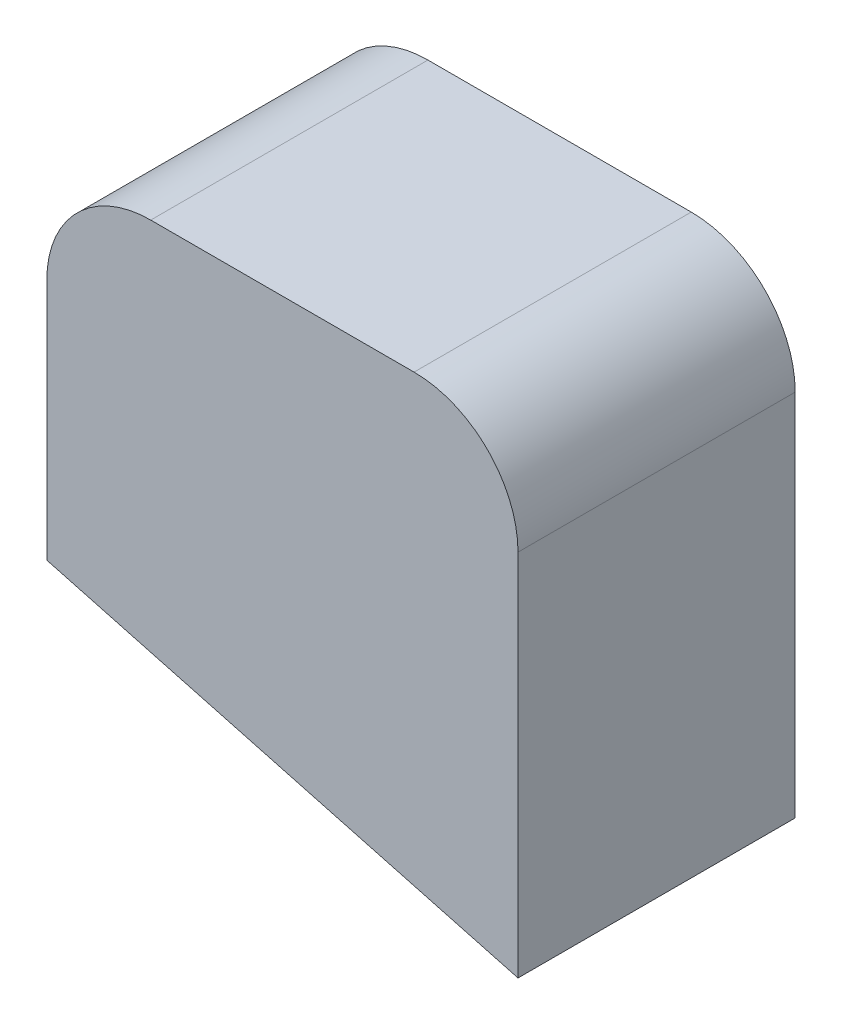
ISO-10303-21;
HEADER;
FILE_DESCRIPTION(('STEP AP214'),'2;1');
FILE_NAME('part.step','',(''),(''),'','','');
FILE_SCHEMA(('AUTOMOTIVE_DESIGN { 1 0 10303 214 1 1 1 1 }'));
ENDSEC;
DATA;
#1=APPLICATION_CONTEXT('core data for automotive mechanical design processes');
#2=APPLICATION_PROTOCOL_DEFINITION('international standard','automotive_design',2000,#1);
#3=PRODUCT_CONTEXT('',#1,'mechanical');
#4=PRODUCT('Part','Part','',(#3));
#5=PRODUCT_RELATED_PRODUCT_CATEGORY('part','',(#4));
#6=PRODUCT_DEFINITION_FORMATION('','',#4);
#7=PRODUCT_DEFINITION_CONTEXT('part definition',#1,'design');
#8=PRODUCT_DEFINITION('design','',#6,#7);
#9=PRODUCT_DEFINITION_SHAPE('','',#8);
#10=(LENGTH_UNIT() NAMED_UNIT(*) SI_UNIT(.MILLI.,.METRE.));
#11=(NAMED_UNIT(*) PLANE_ANGLE_UNIT() SI_UNIT($,.RADIAN.));
#12=(NAMED_UNIT(*) SI_UNIT($,.STERADIAN.) SOLID_ANGLE_UNIT());
#13=UNCERTAINTY_MEASURE_WITH_UNIT(LENGTH_MEASURE(1.E-05),#10,'distance_accuracy_value','');
#14=(GEOMETRIC_REPRESENTATION_CONTEXT(3) GLOBAL_UNCERTAINTY_ASSIGNED_CONTEXT((#13)) GLOBAL_UNIT_ASSIGNED_CONTEXT((#10,
#11,#12)) REPRESENTATION_CONTEXT('',''));
#15=CARTESIAN_POINT('',(0.,0.,0.));
#16=DIRECTION('',(0.,0.,1.));
#17=DIRECTION('',(1.,0.,0.));
#18=AXIS2_PLACEMENT_3D('',#15,#16,#17);
#19=CARTESIAN_POINT('',(0.,13.6441090170633,8.));
#20=DIRECTION('',(0.,1.,0.));
#21=DIRECTION('',(0.,0.,1.));
#22=AXIS2_PLACEMENT_3D('',#19,#20,#21);
#23=PLANE('',#22);
#24=DIRECTION('',(1.,0.,0.));
#25=VECTOR('',#24,1.);
#26=CARTESIAN_POINT('',(0.,13.6441090170633,8.));
#27=LINE('',#26,#25);
#28=CARTESIAN_POINT('',(-10.6,13.6441090170633,8.));
#29=VERTEX_POINT('',#28);
#30=CARTESIAN_POINT('',(-3.,13.6441090170633,8.));
#31=VERTEX_POINT('',#30);
#32=EDGE_CURVE('E106',#29,#31,#27,.T.);
#33=ORIENTED_EDGE('',*,*,#32,.T.);
#34=DIRECTION('',(0.,0.,-1.));
#35=VECTOR('',#34,1.);
#36=CARTESIAN_POINT('',(-3.,13.6441090170633,8.));
#37=LINE('',#36,#35);
#38=CARTESIAN_POINT('',(-3.,13.6441090170633,0.));
#39=VERTEX_POINT('',#38);
#40=EDGE_CURVE('E126',#31,#39,#37,.T.);
#41=ORIENTED_EDGE('',*,*,#40,.T.);
#42=DIRECTION('',(1.,0.,0.));
#43=VECTOR('',#42,1.);
#44=CARTESIAN_POINT('',(0.,13.6441090170633,0.));
#45=LINE('',#44,#43);
#46=CARTESIAN_POINT('',(-10.6,13.6441090170633,0.));
#47=VERTEX_POINT('',#46);
#48=EDGE_CURVE('E116',#47,#39,#45,.T.);
#49=ORIENTED_EDGE('',*,*,#48,.F.);
#50=DIRECTION('',(0.,0.,-1.));
#51=VECTOR('',#50,1.);
#52=CARTESIAN_POINT('',(-10.6,13.6441090170633,8.));
#53=LINE('',#52,#51);
#54=EDGE_CURVE('E100',#47,#29,#53,.F.);
#55=ORIENTED_EDGE('',*,*,#54,.T.);
#56=EDGE_LOOP('',(#33,#41,#49,#55));
#57=FACE_BOUND('',#56,.T.);
#58=ADVANCED_FACE('F35',(#57),#23,.T.);
#59=CARTESIAN_POINT('',(-13.6,0.,8.));
#60=DIRECTION('',(-1.,0.,0.));
#61=DIRECTION('',(0.,0.,1.));
#62=AXIS2_PLACEMENT_3D('',#59,#60,#61);
#63=PLANE('',#62);
#64=DIRECTION('',(0.,1.,0.));
#65=VECTOR('',#64,1.);
#66=CARTESIAN_POINT('',(-13.6,0.,8.));
#67=LINE('',#66,#65);
#68=CARTESIAN_POINT('',(-13.6,3.64410901706328,8.));
#69=VERTEX_POINT('',#68);
#70=CARTESIAN_POINT('',(-13.6,10.6441090170633,8.));
#71=VERTEX_POINT('',#70);
#72=EDGE_CURVE('E92',#69,#71,#67,.T.);
#73=ORIENTED_EDGE('',*,*,#72,.T.);
#74=DIRECTION('',(0.,0.,-1.));
#75=VECTOR('',#74,1.);
#76=CARTESIAN_POINT('',(-13.6,10.6441090170633,8.));
#77=LINE('',#76,#75);
#78=CARTESIAN_POINT('',(-13.6,10.6441090170633,0.));
#79=VERTEX_POINT('',#78);
#80=EDGE_CURVE('E11',#71,#79,#77,.T.);
#81=ORIENTED_EDGE('',*,*,#80,.T.);
#82=DIRECTION('',(0.,1.,0.));
#83=VECTOR('',#82,1.);
#84=CARTESIAN_POINT('',(-13.6,0.,0.));
#85=LINE('',#84,#83);
#86=CARTESIAN_POINT('',(-13.6,3.64410901706328,0.));
#87=VERTEX_POINT('',#86);
#88=EDGE_CURVE('E95',#87,#79,#85,.T.);
#89=ORIENTED_EDGE('',*,*,#88,.F.);
#90=DIRECTION('',(0.,0.,-1.));
#91=VECTOR('',#90,1.);
#92=CARTESIAN_POINT('',(-13.6,3.64410901706328,8.));
#93=LINE('',#92,#91);
#94=EDGE_CURVE('E90',#69,#87,#93,.T.);
#95=ORIENTED_EDGE('',*,*,#94,.F.);
#96=EDGE_LOOP('',(#73,#81,#89,#95));
#97=FACE_BOUND('',#96,.T.);
#98=ADVANCED_FACE('F91',(#97),#63,.T.);
#99=CARTESIAN_POINT('',(0.,0.,8.));
#100=DIRECTION('',(-0.258819045102521,-0.965925826289068,0.));
#101=DIRECTION('',(0.965925826289068,-0.258819045102521,0.));
#102=AXIS2_PLACEMENT_3D('',#99,#100,#101);
#103=PLANE('',#102);
#104=DIRECTION('',(-0.965925826289068,0.258819045102521,0.));
#105=VECTOR('',#104,1.);
#106=CARTESIAN_POINT('',(0.,0.,0.));
#107=LINE('',#106,#105);
#108=CARTESIAN_POINT('',(0.,0.,0.));
#109=VERTEX_POINT('',#108);
#110=EDGE_CURVE('E120',#109,#87,#107,.T.);
#111=ORIENTED_EDGE('',*,*,#110,.F.);
#112=DIRECTION('',(0.,0.,-1.));
#113=VECTOR('',#112,1.);
#114=CARTESIAN_POINT('',(0.,0.,8.));
#115=LINE('',#114,#113);
#116=CARTESIAN_POINT('',(0.,0.,8.));
#117=VERTEX_POINT('',#116);
#118=EDGE_CURVE('E101',#117,#109,#115,.T.);
#119=ORIENTED_EDGE('',*,*,#118,.F.);
#120=DIRECTION('',(-0.965925826289068,0.258819045102521,0.));
#121=VECTOR('',#120,1.);
#122=CARTESIAN_POINT('',(0.,0.,8.));
#123=LINE('',#122,#121);
#124=EDGE_CURVE('E105',#117,#69,#123,.T.);
#125=ORIENTED_EDGE('',*,*,#124,.T.);
#126=ORIENTED_EDGE('',*,*,#94,.T.);
#127=EDGE_LOOP('',(#111,#119,#125,#126));
#128=FACE_BOUND('',#127,.T.);
#129=ADVANCED_FACE('F109',(#128),#103,.T.);
#130=CARTESIAN_POINT('',(0.,0.,8.));
#131=DIRECTION('',(1.,0.,0.));
#132=DIRECTION('',(0.,0.,-1.));
#133=AXIS2_PLACEMENT_3D('',#130,#131,#132);
#134=PLANE('',#133);
#135=DIRECTION('',(0.,-1.,0.));
#136=VECTOR('',#135,1.);
#137=CARTESIAN_POINT('',(0.,0.,0.));
#138=LINE('',#137,#136);
#139=CARTESIAN_POINT('',(0.,10.6441090170633,0.));
#140=VERTEX_POINT('',#139);
#141=EDGE_CURVE('E122',#140,#109,#138,.T.);
#142=ORIENTED_EDGE('',*,*,#141,.F.);
#143=DIRECTION('',(0.,0.,-1.));
#144=VECTOR('',#143,1.);
#145=CARTESIAN_POINT('',(0.,10.6441090170633,8.));
#146=LINE('',#145,#144);
#147=CARTESIAN_POINT('',(0.,10.6441090170633,8.));
#148=VERTEX_POINT('',#147);
#149=EDGE_CURVE('E58',#140,#148,#146,.F.);
#150=ORIENTED_EDGE('',*,*,#149,.T.);
#151=DIRECTION('',(0.,-1.,0.));
#152=VECTOR('',#151,1.);
#153=CARTESIAN_POINT('',(0.,0.,8.));
#154=LINE('',#153,#152);
#155=EDGE_CURVE('E111',#148,#117,#154,.T.);
#156=ORIENTED_EDGE('',*,*,#155,.T.);
#157=ORIENTED_EDGE('',*,*,#118,.T.);
#158=EDGE_LOOP('',(#142,#150,#156,#157));
#159=FACE_BOUND('',#158,.T.);
#160=ADVANCED_FACE('F144',(#159),#134,.T.);
#161=CARTESIAN_POINT('',(0.,0.,8.));
#162=DIRECTION('',(0.,0.,1.));
#163=DIRECTION('',(1.,0.,0.));
#164=AXIS2_PLACEMENT_3D('',#161,#162,#163);
#165=PLANE('',#164);
#166=ORIENTED_EDGE('',*,*,#155,.F.);
#167=CARTESIAN_POINT('',(-3.,10.6441090170633,8.));
#168=DIRECTION('',(0.,0.,1.));
#169=DIRECTION('',(1.,0.,0.));
#170=AXIS2_PLACEMENT_3D('',#167,#168,#169);
#171=CIRCLE('',#170,3.);
#172=EDGE_CURVE('E43',#148,#31,#171,.T.);
#173=ORIENTED_EDGE('',*,*,#172,.T.);
#174=ORIENTED_EDGE('',*,*,#32,.F.);
#175=CARTESIAN_POINT('',(-10.6,10.6441090170633,8.));
#176=DIRECTION('',(0.,0.,1.));
#177=DIRECTION('',(1.,0.,0.));
#178=AXIS2_PLACEMENT_3D('',#175,#176,#177);
#179=CIRCLE('',#178,3.);
#180=EDGE_CURVE('E50',#29,#71,#179,.T.);
#181=ORIENTED_EDGE('',*,*,#180,.T.);
#182=ORIENTED_EDGE('',*,*,#72,.F.);
#183=ORIENTED_EDGE('',*,*,#124,.F.);
#184=EDGE_LOOP('',(#166,#173,#174,#181,#182,#183));
#185=FACE_BOUND('',#184,.T.);
#186=ADVANCED_FACE('F104',(#185),#165,.T.);
#187=CARTESIAN_POINT('',(0.,0.,0.));
#188=DIRECTION('',(0.,0.,1.));
#189=DIRECTION('',(1.,0.,0.));
#190=AXIS2_PLACEMENT_3D('',#187,#188,#189);
#191=PLANE('',#190);
#192=ORIENTED_EDGE('',*,*,#48,.T.);
#193=CARTESIAN_POINT('',(-3.,10.6441090170633,0.));
#194=DIRECTION('',(0.,0.,1.));
#195=DIRECTION('',(1.,0.,0.));
#196=AXIS2_PLACEMENT_3D('',#193,#194,#195);
#197=CIRCLE('',#196,3.);
#198=EDGE_CURVE('E131',#39,#140,#197,.F.);
#199=ORIENTED_EDGE('',*,*,#198,.T.);
#200=ORIENTED_EDGE('',*,*,#141,.T.);
#201=ORIENTED_EDGE('',*,*,#110,.T.);
#202=ORIENTED_EDGE('',*,*,#88,.T.);
#203=CARTESIAN_POINT('',(-10.6,10.6441090170633,0.));
#204=DIRECTION('',(0.,0.,1.));
#205=DIRECTION('',(1.,0.,0.));
#206=AXIS2_PLACEMENT_3D('',#203,#204,#205);
#207=CIRCLE('',#206,3.);
#208=EDGE_CURVE('E129',#79,#47,#207,.F.);
#209=ORIENTED_EDGE('',*,*,#208,.T.);
#210=EDGE_LOOP('',(#192,#199,#200,#201,#202,#209));
#211=FACE_BOUND('',#210,.T.);
#212=ADVANCED_FACE('F143',(#211),#191,.F.);
#213=CARTESIAN_POINT('',(-3.,10.6441090170633,8.));
#214=DIRECTION('',(0.,0.,-1.));
#215=DIRECTION('',(-1.,0.,0.));
#216=AXIS2_PLACEMENT_3D('',#213,#214,#215);
#217=CYLINDRICAL_SURFACE('',#216,3.);
#218=ORIENTED_EDGE('',*,*,#172,.F.);
#219=ORIENTED_EDGE('',*,*,#149,.F.);
#220=ORIENTED_EDGE('',*,*,#198,.F.);
#221=ORIENTED_EDGE('',*,*,#40,.F.);
#222=EDGE_LOOP('',(#218,#219,#220,#221));
#223=FACE_BOUND('',#222,.T.);
#224=ADVANCED_FACE('F141',(#223),#217,.T.);
#225=CARTESIAN_POINT('',(-10.6,10.6441090170633,8.));
#226=DIRECTION('',(0.,0.,-1.));
#227=DIRECTION('',(-1.,0.,0.));
#228=AXIS2_PLACEMENT_3D('',#225,#226,#227);
#229=CYLINDRICAL_SURFACE('',#228,3.);
#230=ORIENTED_EDGE('',*,*,#180,.F.);
#231=ORIENTED_EDGE('',*,*,#54,.F.);
#232=ORIENTED_EDGE('',*,*,#208,.F.);
#233=ORIENTED_EDGE('',*,*,#80,.F.);
#234=EDGE_LOOP('',(#230,#231,#232,#233));
#235=FACE_BOUND('',#234,.T.);
#236=ADVANCED_FACE('F37',(#235),#229,.T.);
#237=CLOSED_SHELL('',(#58,#98,#129,#160,#186,#212,#224,#236));
#238=MANIFOLD_SOLID_BREP('B2',#237);
#239=ADVANCED_BREP_SHAPE_REPRESENTATION('',(#18,#238),#14);
#240=SHAPE_DEFINITION_REPRESENTATION(#9,#239);
ENDSEC;
END-ISO-10303-21;
